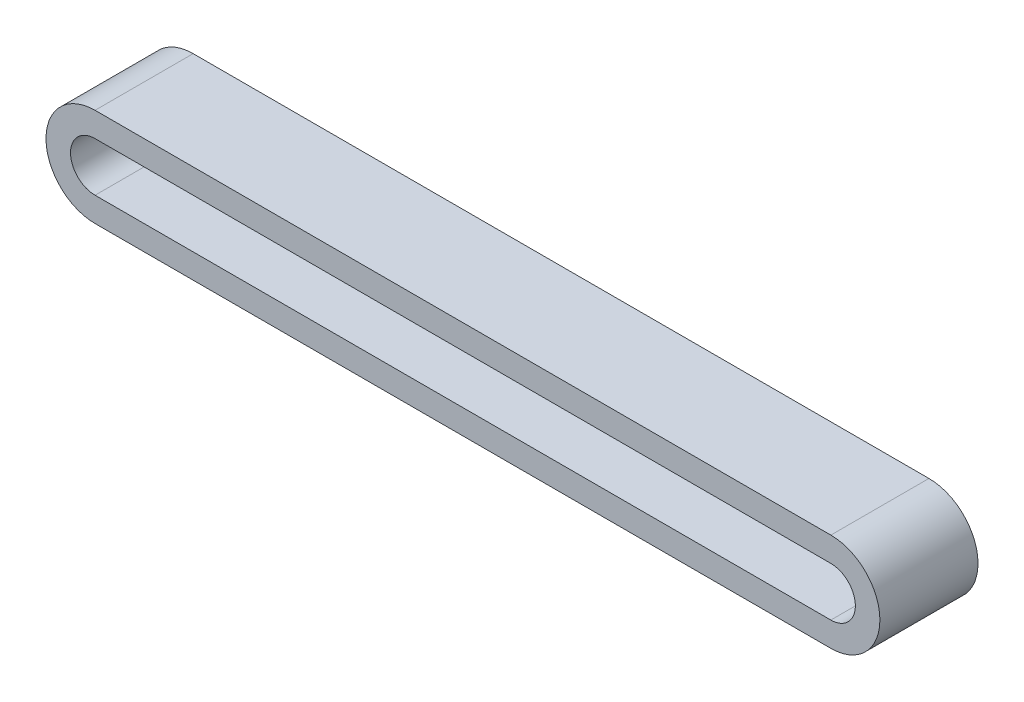
ISO-10303-21;
HEADER;
FILE_DESCRIPTION(('STEP AP214'),'2;1');
FILE_NAME('part.step','',(''),(''),'','','');
FILE_SCHEMA(('AUTOMOTIVE_DESIGN { 1 0 10303 214 1 1 1 1 }'));
ENDSEC;
DATA;
#1=APPLICATION_CONTEXT('core data for automotive mechanical design processes');
#2=APPLICATION_PROTOCOL_DEFINITION('international standard','automotive_design',2000,#1);
#3=PRODUCT_CONTEXT('',#1,'mechanical');
#4=PRODUCT('Part','Part','',(#3));
#5=PRODUCT_RELATED_PRODUCT_CATEGORY('part','',(#4));
#6=PRODUCT_DEFINITION_FORMATION('','',#4);
#7=PRODUCT_DEFINITION_CONTEXT('part definition',#1,'design');
#8=PRODUCT_DEFINITION('design','',#6,#7);
#9=PRODUCT_DEFINITION_SHAPE('','',#8);
#10=(LENGTH_UNIT() NAMED_UNIT(*) SI_UNIT(.MILLI.,.METRE.));
#11=(NAMED_UNIT(*) PLANE_ANGLE_UNIT() SI_UNIT($,.RADIAN.));
#12=(NAMED_UNIT(*) SI_UNIT($,.STERADIAN.) SOLID_ANGLE_UNIT());
#13=UNCERTAINTY_MEASURE_WITH_UNIT(LENGTH_MEASURE(1.E-05),#10,'distance_accuracy_value','');
#14=(GEOMETRIC_REPRESENTATION_CONTEXT(3) GLOBAL_UNCERTAINTY_ASSIGNED_CONTEXT((#13)) GLOBAL_UNIT_ASSIGNED_CONTEXT((#10,
#11,#12)) REPRESENTATION_CONTEXT('',''));
#15=CARTESIAN_POINT('',(0.,0.,0.));
#16=DIRECTION('',(0.,0.,1.));
#17=DIRECTION('',(1.,0.,0.));
#18=AXIS2_PLACEMENT_3D('',#15,#16,#17);
#19=CARTESIAN_POINT('',(75.,0.,20.));
#20=DIRECTION('',(0.,0.,1.));
#21=DIRECTION('',(1.,0.,0.));
#22=AXIS2_PLACEMENT_3D('',#19,#20,#21);
#23=PLANE('',#22);
#24=CARTESIAN_POINT('',(75.,0.,20.));
#25=DIRECTION('',(0.,0.,1.));
#26=DIRECTION('',(1.,0.,0.));
#27=AXIS2_PLACEMENT_3D('',#24,#25,#26);
#28=CIRCLE('',#27,9.99999999999997);
#29=CARTESIAN_POINT('',(75.,-9.99999999999997,20.));
#30=VERTEX_POINT('',#29);
#31=CARTESIAN_POINT('',(75.,9.99999999999998,20.));
#32=VERTEX_POINT('',#31);
#33=EDGE_CURVE('E134',#30,#32,#28,.T.);
#34=ORIENTED_EDGE('',*,*,#33,.T.);
#35=DIRECTION('',(-1.,0.,0.));
#36=VECTOR('',#35,1.);
#37=CARTESIAN_POINT('',(75.,9.99999999999998,20.));
#38=LINE('',#37,#36);
#39=CARTESIAN_POINT('',(-75.,9.99999999999997,20.));
#40=VERTEX_POINT('',#39);
#41=EDGE_CURVE('E137',#32,#40,#38,.T.);
#42=ORIENTED_EDGE('',*,*,#41,.T.);
#43=CARTESIAN_POINT('',(-75.,0.,20.));
#44=DIRECTION('',(0.,0.,1.));
#45=DIRECTION('',(1.,0.,0.));
#46=AXIS2_PLACEMENT_3D('',#43,#44,#45);
#47=CIRCLE('',#46,9.99999999999997);
#48=CARTESIAN_POINT('',(-75.,-9.99999999999999,20.));
#49=VERTEX_POINT('',#48);
#50=EDGE_CURVE('E140',#40,#49,#47,.T.);
#51=ORIENTED_EDGE('',*,*,#50,.T.);
#52=DIRECTION('',(1.,0.,0.));
#53=VECTOR('',#52,1.);
#54=CARTESIAN_POINT('',(75.,-9.99999999999997,20.));
#55=LINE('',#54,#53);
#56=EDGE_CURVE('E142',#49,#30,#55,.T.);
#57=ORIENTED_EDGE('',*,*,#56,.T.);
#58=EDGE_LOOP('',(#34,#42,#51,#57));
#59=FACE_BOUND('',#58,.T.);
#60=DIRECTION('',(1.,0.,0.));
#61=VECTOR('',#60,1.);
#62=CARTESIAN_POINT('',(-75.,-5.,20.));
#63=LINE('',#62,#61);
#64=CARTESIAN_POINT('',(-75.,-5.,20.));
#65=VERTEX_POINT('',#64);
#66=CARTESIAN_POINT('',(75.,-4.99999999999997,20.));
#67=VERTEX_POINT('',#66);
#68=EDGE_CURVE('E106',#65,#67,#63,.T.);
#69=ORIENTED_EDGE('',*,*,#68,.F.);
#70=CARTESIAN_POINT('',(-75.,0.,20.));
#71=DIRECTION('',(0.,0.,1.));
#72=DIRECTION('',(1.,0.,0.));
#73=AXIS2_PLACEMENT_3D('',#70,#71,#72);
#74=CIRCLE('',#73,5.);
#75=CARTESIAN_POINT('',(-75.,5.,20.));
#76=VERTEX_POINT('',#75);
#77=EDGE_CURVE('E98',#76,#65,#74,.T.);
#78=ORIENTED_EDGE('',*,*,#77,.F.);
#79=DIRECTION('',(-1.,0.,0.));
#80=VECTOR('',#79,1.);
#81=CARTESIAN_POINT('',(-75.,5.,20.));
#82=LINE('',#81,#80);
#83=CARTESIAN_POINT('',(75.,5.00000000000003,20.));
#84=VERTEX_POINT('',#83);
#85=EDGE_CURVE('E120',#84,#76,#82,.T.);
#86=ORIENTED_EDGE('',*,*,#85,.F.);
#87=CARTESIAN_POINT('',(75.,0.,20.));
#88=DIRECTION('',(0.,0.,1.));
#89=DIRECTION('',(1.,0.,0.));
#90=AXIS2_PLACEMENT_3D('',#87,#88,#89);
#91=CIRCLE('',#90,5.);
#92=EDGE_CURVE('E118',#67,#84,#91,.T.);
#93=ORIENTED_EDGE('',*,*,#92,.F.);
#94=EDGE_LOOP('',(#69,#78,#86,#93));
#95=FACE_BOUND('',#94,.T.);
#96=ADVANCED_FACE('F33',(#59,#95),#23,.T.);
#97=CARTESIAN_POINT('',(75.,0.,0.));
#98=DIRECTION('',(0.,0.,1.));
#99=DIRECTION('',(1.,0.,0.));
#100=AXIS2_PLACEMENT_3D('',#97,#98,#99);
#101=PLANE('',#100);
#102=CARTESIAN_POINT('',(75.,0.,0.));
#103=DIRECTION('',(0.,0.,1.));
#104=DIRECTION('',(1.,0.,0.));
#105=AXIS2_PLACEMENT_3D('',#102,#103,#104);
#106=CIRCLE('',#105,9.99999999999997);
#107=CARTESIAN_POINT('',(75.,-9.99999999999997,0.));
#108=VERTEX_POINT('',#107);
#109=CARTESIAN_POINT('',(75.,9.99999999999998,0.));
#110=VERTEX_POINT('',#109);
#111=EDGE_CURVE('E114',#108,#110,#106,.T.);
#112=ORIENTED_EDGE('',*,*,#111,.F.);
#113=DIRECTION('',(1.,0.,0.));
#114=VECTOR('',#113,1.);
#115=CARTESIAN_POINT('',(75.,-9.99999999999997,0.));
#116=LINE('',#115,#114);
#117=CARTESIAN_POINT('',(-75.,-9.99999999999999,0.));
#118=VERTEX_POINT('',#117);
#119=EDGE_CURVE('E138',#118,#108,#116,.T.);
#120=ORIENTED_EDGE('',*,*,#119,.F.);
#121=CARTESIAN_POINT('',(-75.,0.,0.));
#122=DIRECTION('',(0.,0.,1.));
#123=DIRECTION('',(1.,0.,0.));
#124=AXIS2_PLACEMENT_3D('',#121,#122,#123);
#125=CIRCLE('',#124,9.99999999999997);
#126=CARTESIAN_POINT('',(-75.,9.99999999999997,0.));
#127=VERTEX_POINT('',#126);
#128=EDGE_CURVE('E149',#127,#118,#125,.T.);
#129=ORIENTED_EDGE('',*,*,#128,.F.);
#130=DIRECTION('',(-1.,0.,0.));
#131=VECTOR('',#130,1.);
#132=CARTESIAN_POINT('',(75.,9.99999999999998,0.));
#133=LINE('',#132,#131);
#134=EDGE_CURVE('E147',#110,#127,#133,.T.);
#135=ORIENTED_EDGE('',*,*,#134,.F.);
#136=EDGE_LOOP('',(#112,#120,#129,#135));
#137=FACE_BOUND('',#136,.T.);
#138=CARTESIAN_POINT('',(-75.,0.,0.));
#139=DIRECTION('',(0.,0.,1.));
#140=DIRECTION('',(1.,0.,0.));
#141=AXIS2_PLACEMENT_3D('',#138,#139,#140);
#142=CIRCLE('',#141,5.);
#143=CARTESIAN_POINT('',(-75.,5.,0.));
#144=VERTEX_POINT('',#143);
#145=CARTESIAN_POINT('',(-75.,-5.,0.));
#146=VERTEX_POINT('',#145);
#147=EDGE_CURVE('E56',#144,#146,#142,.T.);
#148=ORIENTED_EDGE('',*,*,#147,.T.);
#149=DIRECTION('',(1.,0.,0.));
#150=VECTOR('',#149,1.);
#151=CARTESIAN_POINT('',(-75.,-5.,0.));
#152=LINE('',#151,#150);
#153=CARTESIAN_POINT('',(75.,-4.99999999999997,0.));
#154=VERTEX_POINT('',#153);
#155=EDGE_CURVE('E113',#146,#154,#152,.T.);
#156=ORIENTED_EDGE('',*,*,#155,.T.);
#157=CARTESIAN_POINT('',(75.,0.,0.));
#158=DIRECTION('',(0.,0.,1.));
#159=DIRECTION('',(1.,0.,0.));
#160=AXIS2_PLACEMENT_3D('',#157,#158,#159);
#161=CIRCLE('',#160,5.);
#162=CARTESIAN_POINT('',(75.,5.00000000000003,0.));
#163=VERTEX_POINT('',#162);
#164=EDGE_CURVE('E126',#154,#163,#161,.T.);
#165=ORIENTED_EDGE('',*,*,#164,.T.);
#166=DIRECTION('',(-1.,0.,0.));
#167=VECTOR('',#166,1.);
#168=CARTESIAN_POINT('',(-75.,5.,0.));
#169=LINE('',#168,#167);
#170=EDGE_CURVE('E107',#163,#144,#169,.T.);
#171=ORIENTED_EDGE('',*,*,#170,.T.);
#172=EDGE_LOOP('',(#148,#156,#165,#171));
#173=FACE_BOUND('',#172,.T.);
#174=ADVANCED_FACE('F167',(#137,#173),#101,.F.);
#175=CARTESIAN_POINT('',(75.,0.,20.));
#176=DIRECTION('',(0.,0.,-1.));
#177=DIRECTION('',(-1.,0.,0.));
#178=AXIS2_PLACEMENT_3D('',#175,#176,#177);
#179=CYLINDRICAL_SURFACE('',#178,9.99999999999997);
#180=ORIENTED_EDGE('',*,*,#111,.T.);
#181=DIRECTION('',(0.,0.,-1.));
#182=VECTOR('',#181,1.);
#183=CARTESIAN_POINT('',(75.,9.99999999999998,20.));
#184=LINE('',#183,#182);
#185=EDGE_CURVE('E11',#32,#110,#184,.T.);
#186=ORIENTED_EDGE('',*,*,#185,.F.);
#187=ORIENTED_EDGE('',*,*,#33,.F.);
#188=DIRECTION('',(0.,0.,-1.));
#189=VECTOR('',#188,1.);
#190=CARTESIAN_POINT('',(75.,-9.99999999999997,20.));
#191=LINE('',#190,#189);
#192=EDGE_CURVE('E144',#30,#108,#191,.T.);
#193=ORIENTED_EDGE('',*,*,#192,.T.);
#194=EDGE_LOOP('',(#180,#186,#187,#193));
#195=FACE_BOUND('',#194,.T.);
#196=ADVANCED_FACE('F35',(#195),#179,.T.);
#197=CARTESIAN_POINT('',(75.,9.99999999999998,20.));
#198=DIRECTION('',(0.,-1.,0.));
#199=DIRECTION('',(1.,0.,0.));
#200=AXIS2_PLACEMENT_3D('',#197,#198,#199);
#201=PLANE('',#200);
#202=ORIENTED_EDGE('',*,*,#134,.T.);
#203=DIRECTION('',(0.,0.,-1.));
#204=VECTOR('',#203,1.);
#205=CARTESIAN_POINT('',(-75.,9.99999999999997,20.));
#206=LINE('',#205,#204);
#207=EDGE_CURVE('E41',#40,#127,#206,.T.);
#208=ORIENTED_EDGE('',*,*,#207,.F.);
#209=ORIENTED_EDGE('',*,*,#41,.F.);
#210=ORIENTED_EDGE('',*,*,#185,.T.);
#211=EDGE_LOOP('',(#202,#208,#209,#210));
#212=FACE_BOUND('',#211,.T.);
#213=ADVANCED_FACE('F177',(#212),#201,.F.);
#214=CARTESIAN_POINT('',(-75.,0.,20.));
#215=DIRECTION('',(0.,0.,-1.));
#216=DIRECTION('',(-1.,0.,0.));
#217=AXIS2_PLACEMENT_3D('',#214,#215,#216);
#218=CYLINDRICAL_SURFACE('',#217,9.99999999999997);
#219=ORIENTED_EDGE('',*,*,#128,.T.);
#220=DIRECTION('',(0.,0.,-1.));
#221=VECTOR('',#220,1.);
#222=CARTESIAN_POINT('',(-75.,-9.99999999999999,20.));
#223=LINE('',#222,#221);
#224=EDGE_CURVE('E154',#49,#118,#223,.T.);
#225=ORIENTED_EDGE('',*,*,#224,.F.);
#226=ORIENTED_EDGE('',*,*,#50,.F.);
#227=ORIENTED_EDGE('',*,*,#207,.T.);
#228=EDGE_LOOP('',(#219,#225,#226,#227));
#229=FACE_BOUND('',#228,.T.);
#230=ADVANCED_FACE('F161',(#229),#218,.T.);
#231=CARTESIAN_POINT('',(75.,-9.99999999999997,20.));
#232=DIRECTION('',(0.,1.,0.));
#233=DIRECTION('',(-1.,0.,0.));
#234=AXIS2_PLACEMENT_3D('',#231,#232,#233);
#235=PLANE('',#234);
#236=ORIENTED_EDGE('',*,*,#119,.T.);
#237=ORIENTED_EDGE('',*,*,#192,.F.);
#238=ORIENTED_EDGE('',*,*,#56,.F.);
#239=ORIENTED_EDGE('',*,*,#224,.T.);
#240=EDGE_LOOP('',(#236,#237,#238,#239));
#241=FACE_BOUND('',#240,.T.);
#242=ADVANCED_FACE('F171',(#241),#235,.F.);
#243=CARTESIAN_POINT('',(-75.,0.,20.));
#244=DIRECTION('',(0.,0.,-1.));
#245=DIRECTION('',(-1.,0.,0.));
#246=AXIS2_PLACEMENT_3D('',#243,#244,#245);
#247=CYLINDRICAL_SURFACE('',#246,5.);
#248=ORIENTED_EDGE('',*,*,#147,.F.);
#249=DIRECTION('',(0.,0.,-1.));
#250=VECTOR('',#249,1.);
#251=CARTESIAN_POINT('',(-75.,5.,20.));
#252=LINE('',#251,#250);
#253=EDGE_CURVE('E102',#76,#144,#252,.T.);
#254=ORIENTED_EDGE('',*,*,#253,.F.);
#255=ORIENTED_EDGE('',*,*,#77,.T.);
#256=DIRECTION('',(0.,0.,-1.));
#257=VECTOR('',#256,1.);
#258=CARTESIAN_POINT('',(-75.,-5.,20.));
#259=LINE('',#258,#257);
#260=EDGE_CURVE('E101',#65,#146,#259,.T.);
#261=ORIENTED_EDGE('',*,*,#260,.T.);
#262=EDGE_LOOP('',(#248,#254,#255,#261));
#263=FACE_BOUND('',#262,.T.);
#264=ADVANCED_FACE('F100',(#263),#247,.F.);
#265=CARTESIAN_POINT('',(-75.,-5.,20.));
#266=DIRECTION('',(0.,1.,0.));
#267=DIRECTION('',(-1.,0.,0.));
#268=AXIS2_PLACEMENT_3D('',#265,#266,#267);
#269=PLANE('',#268);
#270=ORIENTED_EDGE('',*,*,#155,.F.);
#271=ORIENTED_EDGE('',*,*,#260,.F.);
#272=ORIENTED_EDGE('',*,*,#68,.T.);
#273=DIRECTION('',(0.,0.,-1.));
#274=VECTOR('',#273,1.);
#275=CARTESIAN_POINT('',(75.,-4.99999999999997,20.));
#276=LINE('',#275,#274);
#277=EDGE_CURVE('E115',#67,#154,#276,.T.);
#278=ORIENTED_EDGE('',*,*,#277,.T.);
#279=EDGE_LOOP('',(#270,#271,#272,#278));
#280=FACE_BOUND('',#279,.T.);
#281=ADVANCED_FACE('F110',(#280),#269,.T.);
#282=CARTESIAN_POINT('',(75.,0.,20.));
#283=DIRECTION('',(0.,0.,-1.));
#284=DIRECTION('',(-1.,0.,0.));
#285=AXIS2_PLACEMENT_3D('',#282,#283,#284);
#286=CYLINDRICAL_SURFACE('',#285,5.);
#287=ORIENTED_EDGE('',*,*,#164,.F.);
#288=ORIENTED_EDGE('',*,*,#277,.F.);
#289=ORIENTED_EDGE('',*,*,#92,.T.);
#290=DIRECTION('',(0.,0.,-1.));
#291=VECTOR('',#290,1.);
#292=CARTESIAN_POINT('',(75.,5.00000000000003,20.));
#293=LINE('',#292,#291);
#294=EDGE_CURVE('E48',#84,#163,#293,.T.);
#295=ORIENTED_EDGE('',*,*,#294,.T.);
#296=EDGE_LOOP('',(#287,#288,#289,#295));
#297=FACE_BOUND('',#296,.T.);
#298=ADVANCED_FACE('F200',(#297),#286,.F.);
#299=CARTESIAN_POINT('',(-75.,5.,20.));
#300=DIRECTION('',(0.,-1.,0.));
#301=DIRECTION('',(1.,0.,0.));
#302=AXIS2_PLACEMENT_3D('',#299,#300,#301);
#303=PLANE('',#302);
#304=ORIENTED_EDGE('',*,*,#170,.F.);
#305=ORIENTED_EDGE('',*,*,#294,.F.);
#306=ORIENTED_EDGE('',*,*,#85,.T.);
#307=ORIENTED_EDGE('',*,*,#253,.T.);
#308=EDGE_LOOP('',(#304,#305,#306,#307));
#309=FACE_BOUND('',#308,.T.);
#310=ADVANCED_FACE('F204',(#309),#303,.T.);
#311=CLOSED_SHELL('',(#96,#174,#196,#213,#230,#242,#264,#281,#298,#310));
#312=MANIFOLD_SOLID_BREP('B2',#311);
#313=ADVANCED_BREP_SHAPE_REPRESENTATION('',(#18,#312),#14);
#314=SHAPE_DEFINITION_REPRESENTATION(#9,#313);
ENDSEC;
END-ISO-10303-21;
